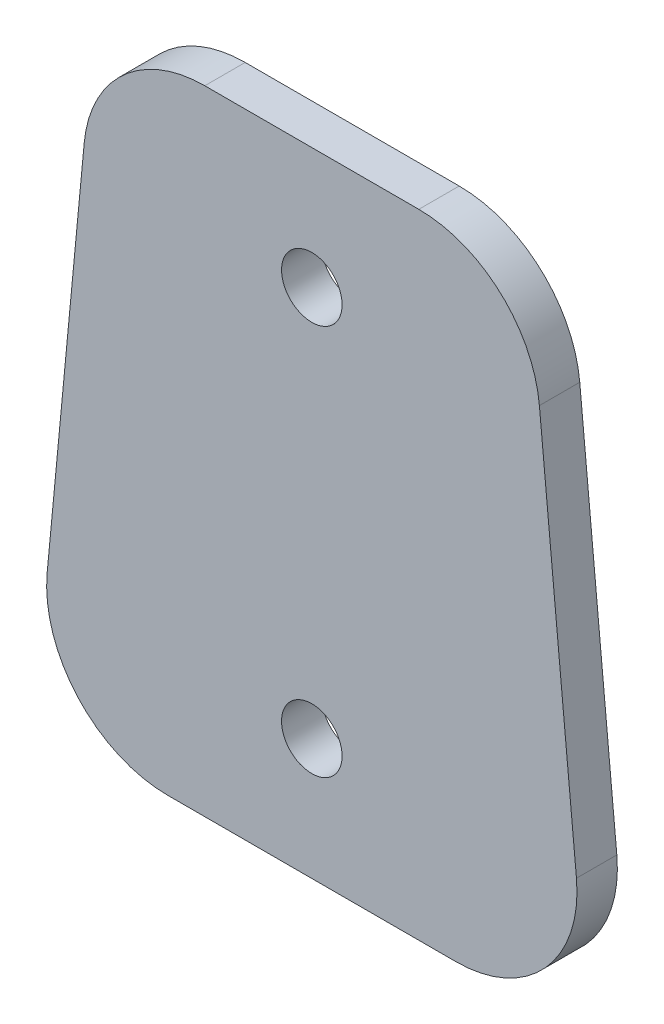
ISO-10303-21;
HEADER;
FILE_DESCRIPTION(('STEP AP214'),'2;1');
FILE_NAME('part.step','',(''),(''),'','','');
FILE_SCHEMA(('AUTOMOTIVE_DESIGN { 1 0 10303 214 1 1 1 1 }'));
ENDSEC;
DATA;
#1=APPLICATION_CONTEXT('core data for automotive mechanical design processes');
#2=APPLICATION_PROTOCOL_DEFINITION('international standard','automotive_design',2000,#1);
#3=PRODUCT_CONTEXT('',#1,'mechanical');
#4=PRODUCT('Part','Part','',(#3));
#5=PRODUCT_RELATED_PRODUCT_CATEGORY('part','',(#4));
#6=PRODUCT_DEFINITION_FORMATION('','',#4);
#7=PRODUCT_DEFINITION_CONTEXT('part definition',#1,'design');
#8=PRODUCT_DEFINITION('design','',#6,#7);
#9=PRODUCT_DEFINITION_SHAPE('','',#8);
#10=(LENGTH_UNIT() NAMED_UNIT(*) SI_UNIT(.MILLI.,.METRE.));
#11=(NAMED_UNIT(*) PLANE_ANGLE_UNIT() SI_UNIT($,.RADIAN.));
#12=(NAMED_UNIT(*) SI_UNIT($,.STERADIAN.) SOLID_ANGLE_UNIT());
#13=UNCERTAINTY_MEASURE_WITH_UNIT(LENGTH_MEASURE(1.E-05),#10,'distance_accuracy_value','');
#14=(GEOMETRIC_REPRESENTATION_CONTEXT(3) GLOBAL_UNCERTAINTY_ASSIGNED_CONTEXT((#13)) GLOBAL_UNIT_ASSIGNED_CONTEXT((#10,
#11,#12)) REPRESENTATION_CONTEXT('',''));
#15=CARTESIAN_POINT('',(0.,0.,0.));
#16=DIRECTION('',(0.,0.,1.));
#17=DIRECTION('',(1.,0.,0.));
#18=AXIS2_PLACEMENT_3D('',#15,#16,#17);
#19=CARTESIAN_POINT('',(12.4821608810161,30.734,3.175));
#20=DIRECTION('',(0.,0.,-1.));
#21=DIRECTION('',(-1.,0.,0.));
#22=AXIS2_PLACEMENT_3D('',#19,#20,#21);
#23=PLANE('',#22);
#24=CARTESIAN_POINT('',(12.4821608810161,30.734,3.175));
#25=DIRECTION('',(0.,0.,1.));
#26=DIRECTION('',(-1.,0.,0.));
#27=AXIS2_PLACEMENT_3D('',#24,#25,#26);
#28=CIRCLE('',#27,9.525);
#29=CARTESIAN_POINT('',(2.99969989442462,31.6331988866596,3.175));
#30=VERTEX_POINT('',#29);
#31=CARTESIAN_POINT('',(12.4821608810162,21.209,3.175));
#32=VERTEX_POINT('',#31);
#33=EDGE_CURVE('E145',#30,#32,#28,.T.);
#34=ORIENTED_EDGE('',*,*,#33,.T.);
#35=DIRECTION('',(1.,0.,0.));
#36=VECTOR('',#35,1.);
#37=CARTESIAN_POINT('',(35.1428391189838,21.209,3.175));
#38=LINE('',#37,#36);
#39=CARTESIAN_POINT('',(35.1428391189838,21.209,3.175));
#40=VERTEX_POINT('',#39);
#41=EDGE_CURVE('E93',#32,#40,#38,.T.);
#42=ORIENTED_EDGE('',*,*,#41,.T.);
#43=CARTESIAN_POINT('',(35.1428391189839,30.734,3.175));
#44=DIRECTION('',(0.,0.,1.));
#45=DIRECTION('',(1.,0.,0.));
#46=AXIS2_PLACEMENT_3D('',#43,#44,#45);
#47=CIRCLE('',#46,9.525);
#48=CARTESIAN_POINT('',(44.6253001055754,31.6331988866596,3.175));
#49=VERTEX_POINT('',#48);
#50=EDGE_CURVE('E160',#40,#49,#47,.T.);
#51=ORIENTED_EDGE('',*,*,#50,.T.);
#52=DIRECTION('',(-0.0944040825889279,0.995533961846879,0.));
#53=VECTOR('',#52,1.);
#54=CARTESIAN_POINT('',(44.6253001055754,31.6331988866596,3.175));
#55=LINE('',#54,#53);
#56=CARTESIAN_POINT('',(41.7108690710927,62.3671988866595,3.175));
#57=VERTEX_POINT('',#56);
#58=EDGE_CURVE('E173',#49,#57,#55,.T.);
#59=ORIENTED_EDGE('',*,*,#58,.T.);
#60=CARTESIAN_POINT('',(32.2284080845011,61.468,3.175));
#61=DIRECTION('',(0.,0.,1.));
#62=DIRECTION('',(-1.,0.,0.));
#63=AXIS2_PLACEMENT_3D('',#60,#61,#62);
#64=CIRCLE('',#63,9.525);
#65=CARTESIAN_POINT('',(32.2284080845011,70.993,3.175));
#66=VERTEX_POINT('',#65);
#67=EDGE_CURVE('E112',#57,#66,#64,.T.);
#68=ORIENTED_EDGE('',*,*,#67,.T.);
#69=DIRECTION('',(-1.,0.,0.));
#70=VECTOR('',#69,1.);
#71=CARTESIAN_POINT('',(15.396591915499,70.993,3.175));
#72=LINE('',#71,#70);
#73=CARTESIAN_POINT('',(15.396591915499,70.993,3.175));
#74=VERTEX_POINT('',#73);
#75=EDGE_CURVE('E106',#66,#74,#72,.T.);
#76=ORIENTED_EDGE('',*,*,#75,.T.);
#77=CARTESIAN_POINT('',(15.3965919154989,61.468,3.175));
#78=DIRECTION('',(0.,0.,1.));
#79=DIRECTION('',(1.,0.,0.));
#80=AXIS2_PLACEMENT_3D('',#77,#78,#79);
#81=CIRCLE('',#80,9.525);
#82=CARTESIAN_POINT('',(5.91413092890736,62.3671988866595,3.175));
#83=VERTEX_POINT('',#82);
#84=EDGE_CURVE('E110',#74,#83,#81,.T.);
#85=ORIENTED_EDGE('',*,*,#84,.T.);
#86=DIRECTION('',(-0.0944040825889282,-0.995533961846879,0.));
#87=VECTOR('',#86,1.);
#88=CARTESIAN_POINT('',(5.91413092890737,62.3671988866595,3.175));
#89=LINE('',#88,#87);
#90=EDGE_CURVE('E50',#83,#30,#89,.T.);
#91=ORIENTED_EDGE('',*,*,#90,.T.);
#92=EDGE_LOOP('',(#34,#42,#51,#59,#68,#76,#85,#91));
#93=FACE_BOUND('',#92,.T.);
#94=CARTESIAN_POINT('',(23.8125,30.734,3.175));
#95=DIRECTION('',(0.,0.,1.));
#96=DIRECTION('',(1.,0.,0.));
#97=AXIS2_PLACEMENT_3D('',#94,#95,#96);
#98=CIRCLE('',#97,2.38125);
#99=CARTESIAN_POINT('',(26.19375,30.734,3.175));
#100=VERTEX_POINT('',#99);
#101=EDGE_CURVE('E134',#100,#100,#98,.T.);
#102=ORIENTED_EDGE('',*,*,#101,.F.);
#103=EDGE_LOOP('',(#102));
#104=FACE_BOUND('',#103,.T.);
#105=CARTESIAN_POINT('',(23.8125,61.468,3.175));
#106=DIRECTION('',(0.,0.,1.));
#107=DIRECTION('',(1.,0.,0.));
#108=AXIS2_PLACEMENT_3D('',#105,#106,#107);
#109=CIRCLE('',#108,2.38125);
#110=CARTESIAN_POINT('',(26.19375,61.468,3.175));
#111=VERTEX_POINT('',#110);
#112=EDGE_CURVE('E182',#111,#111,#109,.T.);
#113=ORIENTED_EDGE('',*,*,#112,.F.);
#114=EDGE_LOOP('',(#113));
#115=FACE_BOUND('',#114,.T.);
#116=ADVANCED_FACE('F33',(#93,#104,#115),#23,.F.);
#117=CARTESIAN_POINT('',(12.4821608810161,30.734,0.));
#118=DIRECTION('',(0.,0.,-1.));
#119=DIRECTION('',(-1.,0.,0.));
#120=AXIS2_PLACEMENT_3D('',#117,#118,#119);
#121=PLANE('',#120);
#122=CARTESIAN_POINT('',(23.8125,30.734,0.));
#123=DIRECTION('',(0.,0.,1.));
#124=DIRECTION('',(1.,0.,0.));
#125=AXIS2_PLACEMENT_3D('',#122,#123,#124);
#126=CIRCLE('',#125,2.38125);
#127=CARTESIAN_POINT('',(26.19375,30.734,0.));
#128=VERTEX_POINT('',#127);
#129=EDGE_CURVE('E179',#128,#128,#126,.T.);
#130=ORIENTED_EDGE('',*,*,#129,.T.);
#131=EDGE_LOOP('',(#130));
#132=FACE_BOUND('',#131,.T.);
#133=CARTESIAN_POINT('',(12.4821608810161,30.734,0.));
#134=DIRECTION('',(0.,0.,1.));
#135=DIRECTION('',(-1.,0.,0.));
#136=AXIS2_PLACEMENT_3D('',#133,#134,#135);
#137=CIRCLE('',#136,9.525);
#138=CARTESIAN_POINT('',(2.99969989442462,31.6331988866596,0.));
#139=VERTEX_POINT('',#138);
#140=CARTESIAN_POINT('',(12.4821608810162,21.209,0.));
#141=VERTEX_POINT('',#140);
#142=EDGE_CURVE('E130',#139,#141,#137,.T.);
#143=ORIENTED_EDGE('',*,*,#142,.F.);
#144=DIRECTION('',(-0.0944040825889282,-0.995533961846879,0.));
#145=VECTOR('',#144,1.);
#146=CARTESIAN_POINT('',(5.91413092890737,62.3671988866595,0.));
#147=LINE('',#146,#145);
#148=CARTESIAN_POINT('',(5.91413092890736,62.3671988866595,0.));
#149=VERTEX_POINT('',#148);
#150=EDGE_CURVE('E85',#149,#139,#147,.T.);
#151=ORIENTED_EDGE('',*,*,#150,.F.);
#152=CARTESIAN_POINT('',(15.3965919154989,61.468,0.));
#153=DIRECTION('',(0.,0.,1.));
#154=DIRECTION('',(1.,0.,0.));
#155=AXIS2_PLACEMENT_3D('',#152,#153,#154);
#156=CIRCLE('',#155,9.525);
#157=CARTESIAN_POINT('',(15.396591915499,70.993,0.));
#158=VERTEX_POINT('',#157);
#159=EDGE_CURVE('E79',#158,#149,#156,.T.);
#160=ORIENTED_EDGE('',*,*,#159,.F.);
#161=DIRECTION('',(-1.,0.,0.));
#162=VECTOR('',#161,1.);
#163=CARTESIAN_POINT('',(15.396591915499,70.993,0.));
#164=LINE('',#163,#162);
#165=CARTESIAN_POINT('',(32.2284080845011,70.993,0.));
#166=VERTEX_POINT('',#165);
#167=EDGE_CURVE('E120',#166,#158,#164,.T.);
#168=ORIENTED_EDGE('',*,*,#167,.F.);
#169=CARTESIAN_POINT('',(32.2284080845011,61.468,0.));
#170=DIRECTION('',(0.,0.,1.));
#171=DIRECTION('',(-1.,0.,0.));
#172=AXIS2_PLACEMENT_3D('',#169,#170,#171);
#173=CIRCLE('',#172,9.525);
#174=CARTESIAN_POINT('',(41.7108690710927,62.3671988866595,0.));
#175=VERTEX_POINT('',#174);
#176=EDGE_CURVE('E140',#175,#166,#173,.T.);
#177=ORIENTED_EDGE('',*,*,#176,.F.);
#178=DIRECTION('',(-0.0944040825889279,0.995533961846879,0.));
#179=VECTOR('',#178,1.);
#180=CARTESIAN_POINT('',(44.6253001055754,31.6331988866596,0.));
#181=LINE('',#180,#179);
#182=CARTESIAN_POINT('',(44.6253001055754,31.6331988866596,0.));
#183=VERTEX_POINT('',#182);
#184=EDGE_CURVE('E138',#183,#175,#181,.T.);
#185=ORIENTED_EDGE('',*,*,#184,.F.);
#186=CARTESIAN_POINT('',(35.1428391189839,30.734,0.));
#187=DIRECTION('',(0.,0.,1.));
#188=DIRECTION('',(1.,0.,0.));
#189=AXIS2_PLACEMENT_3D('',#186,#187,#188);
#190=CIRCLE('',#189,9.525);
#191=CARTESIAN_POINT('',(35.1428391189838,21.209,0.));
#192=VERTEX_POINT('',#191);
#193=EDGE_CURVE('E136',#192,#183,#190,.T.);
#194=ORIENTED_EDGE('',*,*,#193,.F.);
#195=DIRECTION('',(1.,0.,0.));
#196=VECTOR('',#195,1.);
#197=CARTESIAN_POINT('',(35.1428391189838,21.209,0.));
#198=LINE('',#197,#196);
#199=EDGE_CURVE('E133',#141,#192,#198,.T.);
#200=ORIENTED_EDGE('',*,*,#199,.F.);
#201=EDGE_LOOP('',(#143,#151,#160,#168,#177,#185,#194,#200));
#202=FACE_BOUND('',#201,.T.);
#203=CARTESIAN_POINT('',(23.8125,61.468,0.));
#204=DIRECTION('',(0.,0.,1.));
#205=DIRECTION('',(1.,0.,0.));
#206=AXIS2_PLACEMENT_3D('',#203,#204,#205);
#207=CIRCLE('',#206,2.38125);
#208=CARTESIAN_POINT('',(26.19375,61.468,0.));
#209=VERTEX_POINT('',#208);
#210=EDGE_CURVE('E185',#209,#209,#207,.T.);
#211=ORIENTED_EDGE('',*,*,#210,.T.);
#212=EDGE_LOOP('',(#211));
#213=FACE_BOUND('',#212,.T.);
#214=ADVANCED_FACE('F164',(#132,#202,#213),#121,.T.);
#215=CARTESIAN_POINT('',(12.4821608810161,30.734,3.175));
#216=DIRECTION('',(0.,0.,-1.));
#217=DIRECTION('',(-1.,0.,0.));
#218=AXIS2_PLACEMENT_3D('',#215,#216,#217);
#219=CYLINDRICAL_SURFACE('',#218,9.525);
#220=ORIENTED_EDGE('',*,*,#142,.T.);
#221=DIRECTION('',(0.,0.,-1.));
#222=VECTOR('',#221,1.);
#223=CARTESIAN_POINT('',(12.4821608810162,21.209,3.175));
#224=LINE('',#223,#222);
#225=EDGE_CURVE('E11',#32,#141,#224,.T.);
#226=ORIENTED_EDGE('',*,*,#225,.F.);
#227=ORIENTED_EDGE('',*,*,#33,.F.);
#228=DIRECTION('',(0.,0.,-1.));
#229=VECTOR('',#228,1.);
#230=CARTESIAN_POINT('',(2.99969989442462,31.6331988866596,3.175));
#231=LINE('',#230,#229);
#232=EDGE_CURVE('E126',#30,#139,#231,.T.);
#233=ORIENTED_EDGE('',*,*,#232,.T.);
#234=EDGE_LOOP('',(#220,#226,#227,#233));
#235=FACE_BOUND('',#234,.T.);
#236=ADVANCED_FACE('F35',(#235),#219,.T.);
#237=CARTESIAN_POINT('',(35.1428391189838,21.209,3.175));
#238=DIRECTION('',(0.,1.,0.));
#239=DIRECTION('',(-1.,0.,0.));
#240=AXIS2_PLACEMENT_3D('',#237,#238,#239);
#241=PLANE('',#240);
#242=ORIENTED_EDGE('',*,*,#199,.T.);
#243=DIRECTION('',(0.,0.,-1.));
#244=VECTOR('',#243,1.);
#245=CARTESIAN_POINT('',(35.1428391189838,21.209,3.175));
#246=LINE('',#245,#244);
#247=EDGE_CURVE('E42',#40,#192,#246,.T.);
#248=ORIENTED_EDGE('',*,*,#247,.F.);
#249=ORIENTED_EDGE('',*,*,#41,.F.);
#250=ORIENTED_EDGE('',*,*,#225,.T.);
#251=EDGE_LOOP('',(#242,#248,#249,#250));
#252=FACE_BOUND('',#251,.T.);
#253=ADVANCED_FACE('F217',(#252),#241,.F.);
#254=CARTESIAN_POINT('',(35.1428391189839,30.734,3.175));
#255=DIRECTION('',(0.,0.,-1.));
#256=DIRECTION('',(-1.,0.,0.));
#257=AXIS2_PLACEMENT_3D('',#254,#255,#256);
#258=CYLINDRICAL_SURFACE('',#257,9.525);
#259=ORIENTED_EDGE('',*,*,#193,.T.);
#260=DIRECTION('',(0.,0.,-1.));
#261=VECTOR('',#260,1.);
#262=CARTESIAN_POINT('',(44.6253001055754,31.6331988866596,3.175));
#263=LINE('',#262,#261);
#264=EDGE_CURVE('E152',#49,#183,#263,.T.);
#265=ORIENTED_EDGE('',*,*,#264,.F.);
#266=ORIENTED_EDGE('',*,*,#50,.F.);
#267=ORIENTED_EDGE('',*,*,#247,.T.);
#268=EDGE_LOOP('',(#259,#265,#266,#267));
#269=FACE_BOUND('',#268,.T.);
#270=ADVANCED_FACE('F158',(#269),#258,.T.);
#271=CARTESIAN_POINT('',(44.6253001055754,31.6331988866596,3.175));
#272=DIRECTION('',(-0.995533961846879,-0.0944040825889279,0.));
#273=DIRECTION('',(0.0944040825889279,-0.995533961846879,0.));
#274=AXIS2_PLACEMENT_3D('',#271,#272,#273);
#275=PLANE('',#274);
#276=ORIENTED_EDGE('',*,*,#184,.T.);
#277=DIRECTION('',(0.,0.,-1.));
#278=VECTOR('',#277,1.);
#279=CARTESIAN_POINT('',(41.7108690710927,62.3671988866595,3.175));
#280=LINE('',#279,#278);
#281=EDGE_CURVE('E149',#57,#175,#280,.T.);
#282=ORIENTED_EDGE('',*,*,#281,.F.);
#283=ORIENTED_EDGE('',*,*,#58,.F.);
#284=ORIENTED_EDGE('',*,*,#264,.T.);
#285=EDGE_LOOP('',(#276,#282,#283,#284));
#286=FACE_BOUND('',#285,.T.);
#287=ADVANCED_FACE('F169',(#286),#275,.F.);
#288=CARTESIAN_POINT('',(32.2284080845011,61.468,3.175));
#289=DIRECTION('',(0.,0.,-1.));
#290=DIRECTION('',(-1.,0.,0.));
#291=AXIS2_PLACEMENT_3D('',#288,#289,#290);
#292=CYLINDRICAL_SURFACE('',#291,9.525);
#293=ORIENTED_EDGE('',*,*,#176,.T.);
#294=DIRECTION('',(0.,0.,-1.));
#295=VECTOR('',#294,1.);
#296=CARTESIAN_POINT('',(32.2284080845011,70.993,3.175));
#297=LINE('',#296,#295);
#298=EDGE_CURVE('E121',#66,#166,#297,.T.);
#299=ORIENTED_EDGE('',*,*,#298,.F.);
#300=ORIENTED_EDGE('',*,*,#67,.F.);
#301=ORIENTED_EDGE('',*,*,#281,.T.);
#302=EDGE_LOOP('',(#293,#299,#300,#301));
#303=FACE_BOUND('',#302,.T.);
#304=ADVANCED_FACE('F172',(#303),#292,.T.);
#305=CARTESIAN_POINT('',(15.396591915499,70.993,3.175));
#306=DIRECTION('',(0.,-1.,0.));
#307=DIRECTION('',(0.,0.,-1.));
#308=AXIS2_PLACEMENT_3D('',#305,#306,#307);
#309=PLANE('',#308);
#310=ORIENTED_EDGE('',*,*,#167,.T.);
#311=DIRECTION('',(0.,0.,-1.));
#312=VECTOR('',#311,1.);
#313=CARTESIAN_POINT('',(15.396591915499,70.993,3.175));
#314=LINE('',#313,#312);
#315=EDGE_CURVE('E117',#74,#158,#314,.T.);
#316=ORIENTED_EDGE('',*,*,#315,.F.);
#317=ORIENTED_EDGE('',*,*,#75,.F.);
#318=ORIENTED_EDGE('',*,*,#298,.T.);
#319=EDGE_LOOP('',(#310,#316,#317,#318));
#320=FACE_BOUND('',#319,.T.);
#321=ADVANCED_FACE('F118',(#320),#309,.F.);
#322=CARTESIAN_POINT('',(15.3965919154989,61.468,3.175));
#323=DIRECTION('',(0.,0.,-1.));
#324=DIRECTION('',(-1.,0.,0.));
#325=AXIS2_PLACEMENT_3D('',#322,#323,#324);
#326=CYLINDRICAL_SURFACE('',#325,9.525);
#327=ORIENTED_EDGE('',*,*,#159,.T.);
#328=DIRECTION('',(0.,0.,-1.));
#329=VECTOR('',#328,1.);
#330=CARTESIAN_POINT('',(5.91413092890736,62.3671988866595,3.175));
#331=LINE('',#330,#329);
#332=EDGE_CURVE('E122',#83,#149,#331,.T.);
#333=ORIENTED_EDGE('',*,*,#332,.F.);
#334=ORIENTED_EDGE('',*,*,#84,.F.);
#335=ORIENTED_EDGE('',*,*,#315,.T.);
#336=EDGE_LOOP('',(#327,#333,#334,#335));
#337=FACE_BOUND('',#336,.T.);
#338=ADVANCED_FACE('F124',(#337),#326,.T.);
#339=CARTESIAN_POINT('',(5.91413092890737,62.3671988866595,3.175));
#340=DIRECTION('',(0.995533961846879,-0.0944040825889282,0.));
#341=DIRECTION('',(0.0944040825889282,0.995533961846879,0.));
#342=AXIS2_PLACEMENT_3D('',#339,#340,#341);
#343=PLANE('',#342);
#344=ORIENTED_EDGE('',*,*,#150,.T.);
#345=ORIENTED_EDGE('',*,*,#232,.F.);
#346=ORIENTED_EDGE('',*,*,#90,.F.);
#347=ORIENTED_EDGE('',*,*,#332,.T.);
#348=EDGE_LOOP('',(#344,#345,#346,#347));
#349=FACE_BOUND('',#348,.T.);
#350=ADVANCED_FACE('F205',(#349),#343,.F.);
#351=CARTESIAN_POINT('',(23.8125,30.734,3.175));
#352=DIRECTION('',(0.,0.,-1.));
#353=DIRECTION('',(-1.,0.,0.));
#354=AXIS2_PLACEMENT_3D('',#351,#352,#353);
#355=CYLINDRICAL_SURFACE('',#354,2.38125);
#356=ORIENTED_EDGE('',*,*,#101,.T.);
#357=EDGE_LOOP('',(#356));
#358=FACE_BOUND('',#357,.T.);
#359=ORIENTED_EDGE('',*,*,#129,.F.);
#360=EDGE_LOOP('',(#359));
#361=FACE_BOUND('',#360,.T.);
#362=ADVANCED_FACE('F202',(#358,#361),#355,.F.);
#363=CARTESIAN_POINT('',(23.8125,61.468,3.175));
#364=DIRECTION('',(0.,0.,-1.));
#365=DIRECTION('',(-1.,0.,0.));
#366=AXIS2_PLACEMENT_3D('',#363,#364,#365);
#367=CYLINDRICAL_SURFACE('',#366,2.38125);
#368=ORIENTED_EDGE('',*,*,#112,.T.);
#369=EDGE_LOOP('',(#368));
#370=FACE_BOUND('',#369,.T.);
#371=ORIENTED_EDGE('',*,*,#210,.F.);
#372=EDGE_LOOP('',(#371));
#373=FACE_BOUND('',#372,.T.);
#374=ADVANCED_FACE('F191',(#370,#373),#367,.F.);
#375=CLOSED_SHELL('',(#116,#214,#236,#253,#270,#287,#304,#321,#338,#350,#362,#374));
#376=MANIFOLD_SOLID_BREP('B2',#375);
#377=ADVANCED_BREP_SHAPE_REPRESENTATION('',(#18,#376),#14);
#378=SHAPE_DEFINITION_REPRESENTATION(#9,#377);
ENDSEC;
END-ISO-10303-21;
